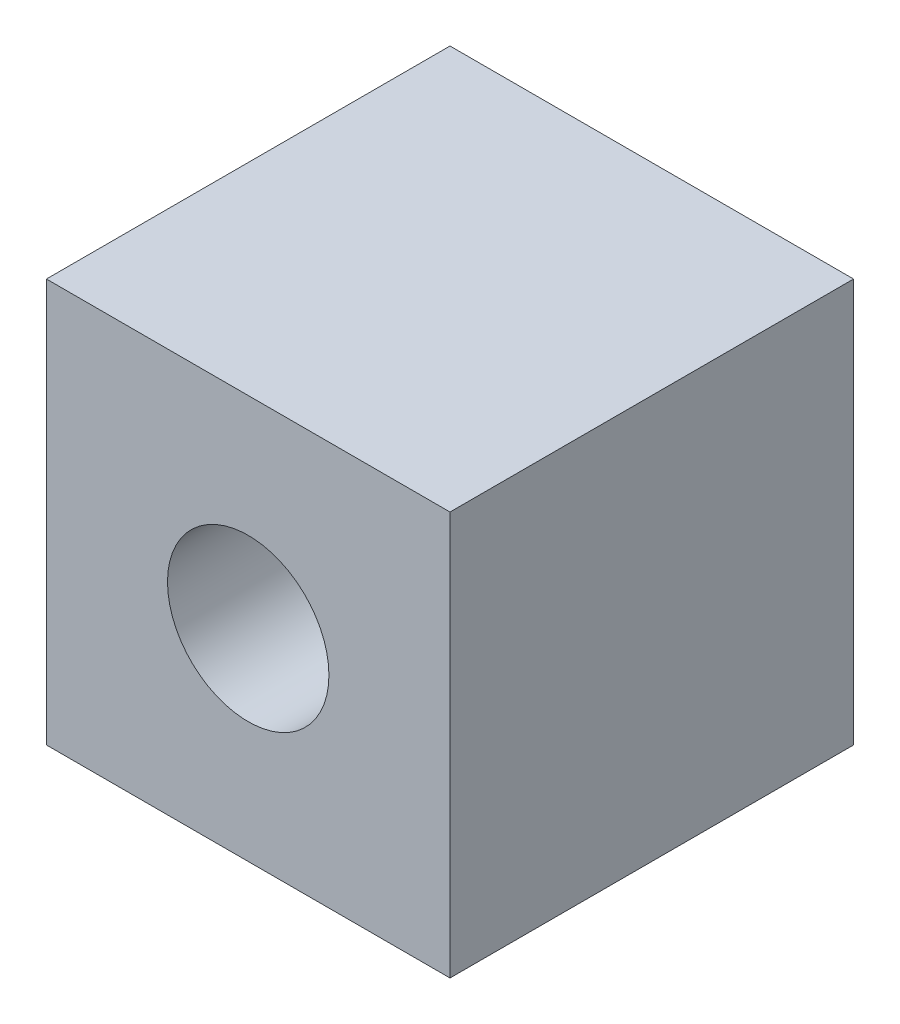
ISO-10303-21;
HEADER;
FILE_DESCRIPTION(('STEP AP214'),'2;1');
FILE_NAME('part.step','',(''),(''),'','','');
FILE_SCHEMA(('AUTOMOTIVE_DESIGN { 1 0 10303 214 1 1 1 1 }'));
ENDSEC;
DATA;
#1=APPLICATION_CONTEXT('core data for automotive mechanical design processes');
#2=APPLICATION_PROTOCOL_DEFINITION('international standard','automotive_design',2000,#1);
#3=PRODUCT_CONTEXT('',#1,'mechanical');
#4=PRODUCT('Part','Part','',(#3));
#5=PRODUCT_RELATED_PRODUCT_CATEGORY('part','',(#4));
#6=PRODUCT_DEFINITION_FORMATION('','',#4);
#7=PRODUCT_DEFINITION_CONTEXT('part definition',#1,'design');
#8=PRODUCT_DEFINITION('design','',#6,#7);
#9=PRODUCT_DEFINITION_SHAPE('','',#8);
#10=(LENGTH_UNIT() NAMED_UNIT(*) SI_UNIT(.MILLI.,.METRE.));
#11=(NAMED_UNIT(*) PLANE_ANGLE_UNIT() SI_UNIT($,.RADIAN.));
#12=(NAMED_UNIT(*) SI_UNIT($,.STERADIAN.) SOLID_ANGLE_UNIT());
#13=UNCERTAINTY_MEASURE_WITH_UNIT(LENGTH_MEASURE(1.E-05),#10,'distance_accuracy_value','');
#14=(GEOMETRIC_REPRESENTATION_CONTEXT(3) GLOBAL_UNCERTAINTY_ASSIGNED_CONTEXT((#13)) GLOBAL_UNIT_ASSIGNED_CONTEXT((#10,
#11,#12)) REPRESENTATION_CONTEXT('',''));
#15=CARTESIAN_POINT('',(0.,0.,0.));
#16=DIRECTION('',(0.,0.,1.));
#17=DIRECTION('',(1.,0.,0.));
#18=AXIS2_PLACEMENT_3D('',#15,#16,#17);
#19=CARTESIAN_POINT('',(0.,5.,-5.));
#20=DIRECTION('',(0.,-1.,0.));
#21=DIRECTION('',(0.,0.,-1.));
#22=AXIS2_PLACEMENT_3D('',#19,#20,#21);
#23=PLANE('',#22);
#24=DIRECTION('',(1.,0.,0.));
#25=VECTOR('',#24,1.);
#26=CARTESIAN_POINT('',(0.,5.,0.));
#27=LINE('',#26,#25);
#28=CARTESIAN_POINT('',(0.,5.,0.));
#29=VERTEX_POINT('',#28);
#30=CARTESIAN_POINT('',(5.,5.,0.));
#31=VERTEX_POINT('',#30);
#32=EDGE_CURVE('E97',#29,#31,#27,.T.);
#33=ORIENTED_EDGE('',*,*,#32,.T.);
#34=DIRECTION('',(0.,0.,1.));
#35=VECTOR('',#34,1.);
#36=CARTESIAN_POINT('',(5.,5.,-5.));
#37=LINE('',#36,#35);
#38=CARTESIAN_POINT('',(5.,5.,-5.));
#39=VERTEX_POINT('',#38);
#40=EDGE_CURVE('E11',#39,#31,#37,.T.);
#41=ORIENTED_EDGE('',*,*,#40,.F.);
#42=DIRECTION('',(1.,0.,0.));
#43=VECTOR('',#42,1.);
#44=CARTESIAN_POINT('',(0.,5.,-5.));
#45=LINE('',#44,#43);
#46=CARTESIAN_POINT('',(0.,5.,-5.));
#47=VERTEX_POINT('',#46);
#48=EDGE_CURVE('E74',#47,#39,#45,.T.);
#49=ORIENTED_EDGE('',*,*,#48,.F.);
#50=DIRECTION('',(0.,0.,1.));
#51=VECTOR('',#50,1.);
#52=CARTESIAN_POINT('',(0.,5.,-5.));
#53=LINE('',#52,#51);
#54=EDGE_CURVE('E93',#47,#29,#53,.T.);
#55=ORIENTED_EDGE('',*,*,#54,.T.);
#56=EDGE_LOOP('',(#33,#41,#49,#55));
#57=FACE_BOUND('',#56,.T.);
#58=ADVANCED_FACE('F35',(#57),#23,.F.);
#59=CARTESIAN_POINT('',(5.,0.,-5.));
#60=DIRECTION('',(1.,0.,0.));
#61=DIRECTION('',(0.,0.,-1.));
#62=AXIS2_PLACEMENT_3D('',#59,#60,#61);
#63=PLANE('',#62);
#64=DIRECTION('',(0.,1.,0.));
#65=VECTOR('',#64,1.);
#66=CARTESIAN_POINT('',(5.,0.,0.));
#67=LINE('',#66,#65);
#68=CARTESIAN_POINT('',(5.,0.,0.));
#69=VERTEX_POINT('',#68);
#70=EDGE_CURVE('E83',#69,#31,#67,.T.);
#71=ORIENTED_EDGE('',*,*,#70,.F.);
#72=DIRECTION('',(0.,0.,1.));
#73=VECTOR('',#72,1.);
#74=CARTESIAN_POINT('',(5.,0.,-5.));
#75=LINE('',#74,#73);
#76=CARTESIAN_POINT('',(5.,0.,-5.));
#77=VERTEX_POINT('',#76);
#78=EDGE_CURVE('E43',#77,#69,#75,.T.);
#79=ORIENTED_EDGE('',*,*,#78,.F.);
#80=DIRECTION('',(0.,1.,0.));
#81=VECTOR('',#80,1.);
#82=CARTESIAN_POINT('',(5.,0.,-5.));
#83=LINE('',#82,#81);
#84=EDGE_CURVE('E81',#77,#39,#83,.T.);
#85=ORIENTED_EDGE('',*,*,#84,.T.);
#86=ORIENTED_EDGE('',*,*,#40,.T.);
#87=EDGE_LOOP('',(#71,#79,#85,#86));
#88=FACE_BOUND('',#87,.T.);
#89=ADVANCED_FACE('F80',(#88),#63,.T.);
#90=CARTESIAN_POINT('',(0.,0.,-5.));
#91=DIRECTION('',(0.,-1.,0.));
#92=DIRECTION('',(0.,0.,-1.));
#93=AXIS2_PLACEMENT_3D('',#90,#91,#92);
#94=PLANE('',#93);
#95=DIRECTION('',(1.,0.,0.));
#96=VECTOR('',#95,1.);
#97=CARTESIAN_POINT('',(0.,0.,0.));
#98=LINE('',#97,#96);
#99=CARTESIAN_POINT('',(0.,0.,0.));
#100=VERTEX_POINT('',#99);
#101=EDGE_CURVE('E102',#100,#69,#98,.T.);
#102=ORIENTED_EDGE('',*,*,#101,.F.);
#103=DIRECTION('',(0.,0.,1.));
#104=VECTOR('',#103,1.);
#105=CARTESIAN_POINT('',(0.,0.,-5.));
#106=LINE('',#105,#104);
#107=CARTESIAN_POINT('',(0.,0.,-5.));
#108=VERTEX_POINT('',#107);
#109=EDGE_CURVE('E66',#108,#100,#106,.T.);
#110=ORIENTED_EDGE('',*,*,#109,.F.);
#111=DIRECTION('',(1.,0.,0.));
#112=VECTOR('',#111,1.);
#113=CARTESIAN_POINT('',(0.,0.,-5.));
#114=LINE('',#113,#112);
#115=EDGE_CURVE('E89',#108,#77,#114,.T.);
#116=ORIENTED_EDGE('',*,*,#115,.T.);
#117=ORIENTED_EDGE('',*,*,#78,.T.);
#118=EDGE_LOOP('',(#102,#110,#116,#117));
#119=FACE_BOUND('',#118,.T.);
#120=ADVANCED_FACE('F91',(#119),#94,.T.);
#121=CARTESIAN_POINT('',(0.,0.,-5.));
#122=DIRECTION('',(1.,0.,0.));
#123=DIRECTION('',(0.,0.,-1.));
#124=AXIS2_PLACEMENT_3D('',#121,#122,#123);
#125=PLANE('',#124);
#126=DIRECTION('',(0.,1.,0.));
#127=VECTOR('',#126,1.);
#128=CARTESIAN_POINT('',(0.,0.,0.));
#129=LINE('',#128,#127);
#130=EDGE_CURVE('E69',#100,#29,#129,.T.);
#131=ORIENTED_EDGE('',*,*,#130,.T.);
#132=ORIENTED_EDGE('',*,*,#54,.F.);
#133=DIRECTION('',(0.,1.,0.));
#134=VECTOR('',#133,1.);
#135=CARTESIAN_POINT('',(0.,0.,-5.));
#136=LINE('',#135,#134);
#137=EDGE_CURVE('E51',#108,#47,#136,.T.);
#138=ORIENTED_EDGE('',*,*,#137,.F.);
#139=ORIENTED_EDGE('',*,*,#109,.T.);
#140=EDGE_LOOP('',(#131,#132,#138,#139));
#141=FACE_BOUND('',#140,.T.);
#142=ADVANCED_FACE('F120',(#141),#125,.F.);
#143=CARTESIAN_POINT('',(0.,0.,-5.));
#144=DIRECTION('',(0.,0.,1.));
#145=DIRECTION('',(1.,0.,0.));
#146=AXIS2_PLACEMENT_3D('',#143,#144,#145);
#147=PLANE('',#146);
#148=CARTESIAN_POINT('',(2.5,2.5,-5.));
#149=DIRECTION('',(0.,0.,1.));
#150=DIRECTION('',(1.,0.,0.));
#151=AXIS2_PLACEMENT_3D('',#148,#149,#150);
#152=CIRCLE('',#151,1.);
#153=CARTESIAN_POINT('',(3.5,2.5,-5.));
#154=VERTEX_POINT('',#153);
#155=EDGE_CURVE('E100',#154,#154,#152,.F.);
#156=ORIENTED_EDGE('',*,*,#155,.F.);
#157=EDGE_LOOP('',(#156));
#158=FACE_BOUND('',#157,.T.);
#159=ORIENTED_EDGE('',*,*,#48,.T.);
#160=ORIENTED_EDGE('',*,*,#84,.F.);
#161=ORIENTED_EDGE('',*,*,#115,.F.);
#162=ORIENTED_EDGE('',*,*,#137,.T.);
#163=EDGE_LOOP('',(#159,#160,#161,#162));
#164=FACE_BOUND('',#163,.T.);
#165=ADVANCED_FACE('F88',(#158,#164),#147,.F.);
#166=CARTESIAN_POINT('',(0.,0.,0.));
#167=DIRECTION('',(0.,0.,1.));
#168=DIRECTION('',(1.,0.,0.));
#169=AXIS2_PLACEMENT_3D('',#166,#167,#168);
#170=PLANE('',#169);
#171=CARTESIAN_POINT('',(2.5,2.5,0.));
#172=DIRECTION('',(0.,0.,1.));
#173=DIRECTION('',(1.,0.,0.));
#174=AXIS2_PLACEMENT_3D('',#171,#172,#173);
#175=CIRCLE('',#174,1.);
#176=CARTESIAN_POINT('',(3.5,2.5,0.));
#177=VERTEX_POINT('',#176);
#178=EDGE_CURVE('E171',#177,#177,#175,.T.);
#179=ORIENTED_EDGE('',*,*,#178,.F.);
#180=EDGE_LOOP('',(#179));
#181=FACE_BOUND('',#180,.T.);
#182=ORIENTED_EDGE('',*,*,#32,.F.);
#183=ORIENTED_EDGE('',*,*,#130,.F.);
#184=ORIENTED_EDGE('',*,*,#101,.T.);
#185=ORIENTED_EDGE('',*,*,#70,.T.);
#186=EDGE_LOOP('',(#182,#183,#184,#185));
#187=FACE_BOUND('',#186,.T.);
#188=ADVANCED_FACE('F109',(#181,#187),#170,.T.);
#189=CARTESIAN_POINT('',(2.5,2.5,-7.82842712474619));
#190=DIRECTION('',(0.,0.,1.));
#191=DIRECTION('',(1.,0.,0.));
#192=AXIS2_PLACEMENT_3D('',#189,#190,#191);
#193=CYLINDRICAL_SURFACE('',#192,1.);
#194=ORIENTED_EDGE('',*,*,#155,.T.);
#195=EDGE_LOOP('',(#194));
#196=FACE_BOUND('',#195,.T.);
#197=ORIENTED_EDGE('',*,*,#178,.T.);
#198=EDGE_LOOP('',(#197));
#199=FACE_BOUND('',#198,.T.);
#200=ADVANCED_FACE('F111',(#196,#199),#193,.F.);
#201=CLOSED_SHELL('',(#58,#89,#120,#142,#165,#188,#200));
#202=MANIFOLD_SOLID_BREP('B2',#201);
#203=ADVANCED_BREP_SHAPE_REPRESENTATION('',(#18,#202),#14);
#204=SHAPE_DEFINITION_REPRESENTATION(#9,#203);
ENDSEC;
END-ISO-10303-21;
